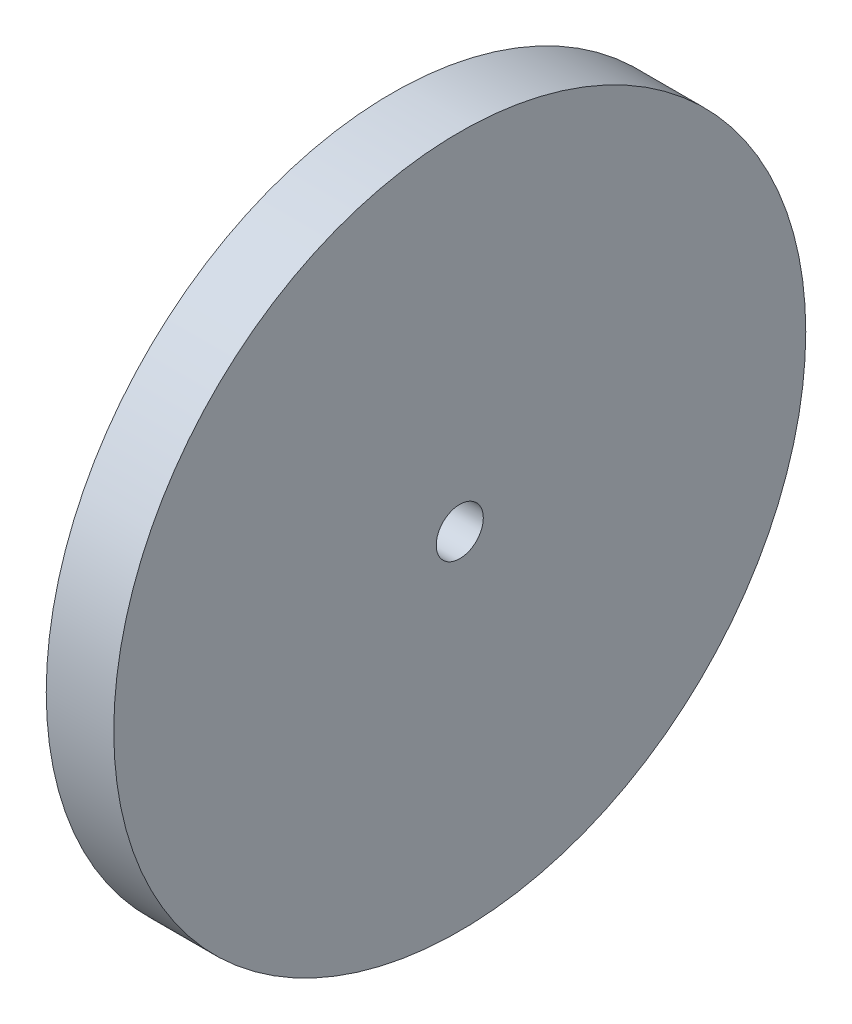
ISO-10303-21;
HEADER;
FILE_DESCRIPTION(('STEP AP214'),'2;1');
FILE_NAME('part.step','',(''),(''),'','','');
FILE_SCHEMA(('AUTOMOTIVE_DESIGN { 1 0 10303 214 1 1 1 1 }'));
ENDSEC;
DATA;
#1=APPLICATION_CONTEXT('core data for automotive mechanical design processes');
#2=APPLICATION_PROTOCOL_DEFINITION('international standard','automotive_design',2000,#1);
#3=PRODUCT_CONTEXT('',#1,'mechanical');
#4=PRODUCT('Part','Part','',(#3));
#5=PRODUCT_RELATED_PRODUCT_CATEGORY('part','',(#4));
#6=PRODUCT_DEFINITION_FORMATION('','',#4);
#7=PRODUCT_DEFINITION_CONTEXT('part definition',#1,'design');
#8=PRODUCT_DEFINITION('design','',#6,#7);
#9=PRODUCT_DEFINITION_SHAPE('','',#8);
#10=(LENGTH_UNIT() NAMED_UNIT(*) SI_UNIT(.MILLI.,.METRE.));
#11=(NAMED_UNIT(*) PLANE_ANGLE_UNIT() SI_UNIT($,.RADIAN.));
#12=(NAMED_UNIT(*) SI_UNIT($,.STERADIAN.) SOLID_ANGLE_UNIT());
#13=UNCERTAINTY_MEASURE_WITH_UNIT(LENGTH_MEASURE(1.E-05),#10,'distance_accuracy_value','');
#14=(GEOMETRIC_REPRESENTATION_CONTEXT(3) GLOBAL_UNCERTAINTY_ASSIGNED_CONTEXT((#13)) GLOBAL_UNIT_ASSIGNED_CONTEXT((#10,
#11,#12)) REPRESENTATION_CONTEXT('',''));
#15=CARTESIAN_POINT('',(0.,0.,0.));
#16=DIRECTION('',(0.,0.,1.));
#17=DIRECTION('',(1.,0.,0.));
#18=AXIS2_PLACEMENT_3D('',#15,#16,#17);
#19=CARTESIAN_POINT('',(3.0988,0.,0.));
#20=DIRECTION('',(-1.,0.,0.));
#21=DIRECTION('',(0.,0.,1.));
#22=AXIS2_PLACEMENT_3D('',#19,#20,#21);
#23=CYLINDRICAL_SURFACE('',#22,15.875);
#24=CARTESIAN_POINT('',(3.0988,0.,0.));
#25=DIRECTION('',(1.,0.,0.));
#26=DIRECTION('',(0.,0.,-1.));
#27=AXIS2_PLACEMENT_3D('',#24,#25,#26);
#28=CIRCLE('',#27,15.875);
#29=CARTESIAN_POINT('',(3.0988,0.,-15.875));
#30=VERTEX_POINT('',#29);
#31=EDGE_CURVE('E10',#30,#30,#28,.T.);
#32=ORIENTED_EDGE('',*,*,#31,.F.);
#33=EDGE_LOOP('',(#32));
#34=FACE_BOUND('',#33,.T.);
#35=CARTESIAN_POINT('',(0.,0.,0.));
#36=DIRECTION('',(1.,0.,0.));
#37=DIRECTION('',(0.,0.,-1.));
#38=AXIS2_PLACEMENT_3D('',#35,#36,#37);
#39=CIRCLE('',#38,15.875);
#40=CARTESIAN_POINT('',(0.,0.,-15.875));
#41=VERTEX_POINT('',#40);
#42=EDGE_CURVE('E33',#41,#41,#39,.T.);
#43=ORIENTED_EDGE('',*,*,#42,.T.);
#44=EDGE_LOOP('',(#43));
#45=FACE_BOUND('',#44,.T.);
#46=ADVANCED_FACE('F30',(#34,#45),#23,.T.);
#47=CARTESIAN_POINT('',(3.0988,0.,0.));
#48=DIRECTION('',(1.,0.,0.));
#49=DIRECTION('',(0.,0.,-1.));
#50=AXIS2_PLACEMENT_3D('',#47,#48,#49);
#51=PLANE('',#50);
#52=CARTESIAN_POINT('',(3.0988,0.,0.));
#53=DIRECTION('',(1.,0.,0.));
#54=DIRECTION('',(0.,0.,-1.));
#55=AXIS2_PLACEMENT_3D('',#52,#53,#54);
#56=CIRCLE('',#55,1.0795);
#57=CARTESIAN_POINT('',(3.0988,0.,-1.0795));
#58=VERTEX_POINT('',#57);
#59=EDGE_CURVE('E40',#58,#58,#56,.T.);
#60=ORIENTED_EDGE('',*,*,#59,.F.);
#61=EDGE_LOOP('',(#60));
#62=FACE_BOUND('',#61,.T.);
#63=ORIENTED_EDGE('',*,*,#31,.T.);
#64=EDGE_LOOP('',(#63));
#65=FACE_BOUND('',#64,.T.);
#66=ADVANCED_FACE('F58',(#62,#65),#51,.T.);
#67=CARTESIAN_POINT('',(0.,0.,0.));
#68=DIRECTION('',(1.,0.,0.));
#69=DIRECTION('',(0.,0.,-1.));
#70=AXIS2_PLACEMENT_3D('',#67,#68,#69);
#71=PLANE('',#70);
#72=CARTESIAN_POINT('',(0.,0.,0.));
#73=DIRECTION('',(1.,0.,0.));
#74=DIRECTION('',(0.,0.,-1.));
#75=AXIS2_PLACEMENT_3D('',#72,#73,#74);
#76=CIRCLE('',#75,1.0795);
#77=CARTESIAN_POINT('',(0.,0.,-1.0795));
#78=VERTEX_POINT('',#77);
#79=EDGE_CURVE('E44',#78,#78,#76,.T.);
#80=ORIENTED_EDGE('',*,*,#79,.T.);
#81=EDGE_LOOP('',(#80));
#82=FACE_BOUND('',#81,.T.);
#83=ORIENTED_EDGE('',*,*,#42,.F.);
#84=EDGE_LOOP('',(#83));
#85=FACE_BOUND('',#84,.T.);
#86=ADVANCED_FACE('F48',(#82,#85),#71,.F.);
#87=CARTESIAN_POINT('',(0.,0.,0.));
#88=DIRECTION('',(1.,0.,0.));
#89=DIRECTION('',(0.,0.,-1.));
#90=AXIS2_PLACEMENT_3D('',#87,#88,#89);
#91=CYLINDRICAL_SURFACE('',#90,1.0795);
#92=CARTESIAN_POINT('',(3.0988,0.,-1.0795));
#93=CARTESIAN_POINT('',(3.06652083333333,0.,-1.0795));
#94=CARTESIAN_POINT('',(3.03424166666667,0.,-1.0795));
#95=CARTESIAN_POINT('',(2.96968333333333,0.,-1.0795));
#96=CARTESIAN_POINT('',(2.93740416666667,0.,-1.0795));
#97=CARTESIAN_POINT('',(2.87284583333333,0.,-1.0795));
#98=CARTESIAN_POINT('',(2.84056666666667,0.,-1.0795));
#99=CARTESIAN_POINT('',(2.77600833333333,0.,-1.0795));
#100=CARTESIAN_POINT('',(2.74372916666667,0.,-1.0795));
#101=CARTESIAN_POINT('',(2.67917083333333,0.,-1.0795));
#102=CARTESIAN_POINT('',(2.64689166666667,0.,-1.0795));
#103=CARTESIAN_POINT('',(2.58233333333333,0.,-1.0795));
#104=CARTESIAN_POINT('',(2.55005416666667,0.,-1.0795));
#105=CARTESIAN_POINT('',(2.48549583333333,0.,-1.0795));
#106=CARTESIAN_POINT('',(2.45321666666667,0.,-1.0795));
#107=CARTESIAN_POINT('',(2.38865833333333,0.,-1.0795));
#108=CARTESIAN_POINT('',(2.35637916666667,0.,-1.0795));
#109=CARTESIAN_POINT('',(2.29182083333333,0.,-1.0795));
#110=CARTESIAN_POINT('',(2.25954166666667,0.,-1.0795));
#111=CARTESIAN_POINT('',(2.19498333333333,0.,-1.0795));
#112=CARTESIAN_POINT('',(2.16270416666667,0.,-1.0795));
#113=CARTESIAN_POINT('',(2.09814583333333,0.,-1.0795));
#114=CARTESIAN_POINT('',(2.06586666666667,0.,-1.0795));
#115=CARTESIAN_POINT('',(2.00130833333333,0.,-1.0795));
#116=CARTESIAN_POINT('',(1.96902916666667,0.,-1.0795));
#117=CARTESIAN_POINT('',(1.90447083333333,0.,-1.0795));
#118=CARTESIAN_POINT('',(1.87219166666667,0.,-1.0795));
#119=CARTESIAN_POINT('',(1.80763333333333,0.,-1.0795));
#120=CARTESIAN_POINT('',(1.77535416666667,0.,-1.0795));
#121=CARTESIAN_POINT('',(1.71079583333333,0.,-1.0795));
#122=CARTESIAN_POINT('',(1.67851666666667,0.,-1.0795));
#123=CARTESIAN_POINT('',(1.61395833333333,0.,-1.0795));
#124=CARTESIAN_POINT('',(1.58167916666667,0.,-1.0795));
#125=CARTESIAN_POINT('',(1.51712083333333,0.,-1.0795));
#126=CARTESIAN_POINT('',(1.48484166666667,0.,-1.0795));
#127=CARTESIAN_POINT('',(1.42028333333333,0.,-1.0795));
#128=CARTESIAN_POINT('',(1.38800416666667,0.,-1.0795));
#129=CARTESIAN_POINT('',(1.32344583333333,0.,-1.0795));
#130=CARTESIAN_POINT('',(1.29116666666667,0.,-1.0795));
#131=CARTESIAN_POINT('',(1.22660833333333,0.,-1.0795));
#132=CARTESIAN_POINT('',(1.19432916666667,0.,-1.0795));
#133=CARTESIAN_POINT('',(1.12977083333333,0.,-1.0795));
#134=CARTESIAN_POINT('',(1.09749166666667,0.,-1.0795));
#135=CARTESIAN_POINT('',(1.03293333333333,0.,-1.0795));
#136=CARTESIAN_POINT('',(1.00065416666667,0.,-1.0795));
#137=CARTESIAN_POINT('',(0.936095833333333,0.,-1.0795));
#138=CARTESIAN_POINT('',(0.903816666666667,0.,-1.0795));
#139=CARTESIAN_POINT('',(0.839258333333333,0.,-1.0795));
#140=CARTESIAN_POINT('',(0.806979166666666,0.,-1.0795));
#141=CARTESIAN_POINT('',(0.742420833333333,0.,-1.0795));
#142=CARTESIAN_POINT('',(0.710141666666666,0.,-1.0795));
#143=CARTESIAN_POINT('',(0.645583333333333,0.,-1.0795));
#144=CARTESIAN_POINT('',(0.613304166666666,0.,-1.0795));
#145=CARTESIAN_POINT('',(0.548745833333333,0.,-1.0795));
#146=CARTESIAN_POINT('',(0.516466666666666,0.,-1.0795));
#147=CARTESIAN_POINT('',(0.451908333333333,0.,-1.0795));
#148=CARTESIAN_POINT('',(0.419629166666666,0.,-1.0795));
#149=CARTESIAN_POINT('',(0.355070833333333,0.,-1.0795));
#150=CARTESIAN_POINT('',(0.322791666666666,0.,-1.0795));
#151=CARTESIAN_POINT('',(0.258233333333333,0.,-1.0795));
#152=CARTESIAN_POINT('',(0.225954166666667,0.,-1.0795));
#153=CARTESIAN_POINT('',(0.161395833333333,0.,-1.0795));
#154=CARTESIAN_POINT('',(0.129116666666667,0.,-1.0795));
#155=CARTESIAN_POINT('',(0.0645583333333333,0.,-1.0795));
#156=CARTESIAN_POINT('',(0.0322791666666666,0.,-1.0795));
#157=CARTESIAN_POINT('',(0.,0.,-1.0795));
#158=B_SPLINE_CURVE_WITH_KNOTS('',3,(#92,#93,#94,#95,#96,#97,#98,#99,#100,#101,#102,#103,#104,
#105,#106,#107,#108,#109,#110,#111,#112,#113,#114,#115,#116,#117,#118,#119,#120,#121,#122,#123,
#124,#125,#126,#127,#128,#129,#130,#131,#132,#133,#134,#135,#136,#137,#138,#139,#140,#141,#142,
#143,#144,#145,#146,#147,#148,#149,#150,#151,#152,#153,#154,#155,#156,#157),.UNSPECIFIED.,.F.,
.F.,(4,2,2,2,2,2,2,2,2,2,2,2,2,2,2,2,2,2,2,2,2,2,2,2,2,2,2,2,2,2,2,2,4),(0.,0.0968375,0.193675,
0.2905125,0.38735,0.4841875,0.581025,0.6778625,0.7747,0.8715375,0.968375,1.0652125,1.16205,
1.2588875,1.355725,1.4525625,1.5494,1.6462375,1.743075,1.8399125,1.93675,2.0335875,2.130425,
2.2272625,2.3241,2.4209375,2.517775,2.6146125,2.71145,2.8082875,2.905125,3.0019625,3.0988),.UNSPECIFIED.);
#159=EDGE_CURVE('BSEAM51',#58,#78,#158,.T.);
#160=ORIENTED_EDGE('',*,*,#59,.T.);
#161=ORIENTED_EDGE('',*,*,#79,.F.);
#162=ORIENTED_EDGE('',*,*,#159,.T.);
#163=ORIENTED_EDGE('',*,*,#159,.F.);
#164=EDGE_LOOP('',(#160,#162,#161,#163));
#165=FACE_BOUND('',#164,.T.);
#166=ADVANCED_FACE('F51',(#165),#91,.F.);
#167=CLOSED_SHELL('',(#46,#66,#86,#166));
#168=MANIFOLD_SOLID_BREP('B2',#167);
#169=ADVANCED_BREP_SHAPE_REPRESENTATION('',(#18,#168),#14);
#170=SHAPE_DEFINITION_REPRESENTATION(#9,#169);
ENDSEC;
END-ISO-10303-21;
